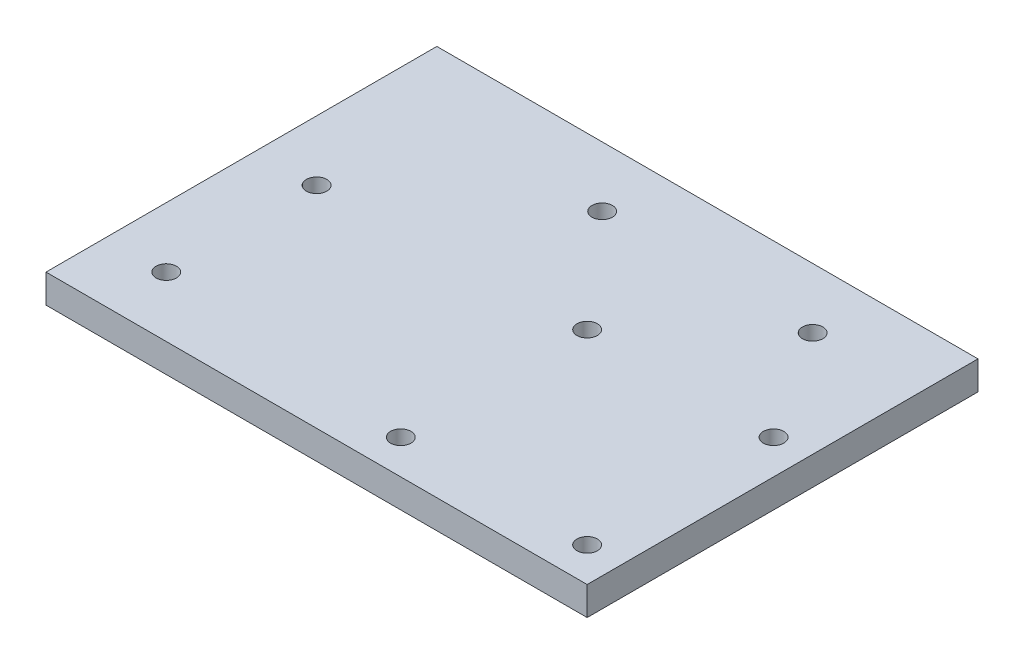
ISO-10303-21;
HEADER;
FILE_DESCRIPTION(('STEP AP214'),'2;1');
FILE_NAME('part.step','',(''),(''),'','','');
FILE_SCHEMA(('AUTOMOTIVE_DESIGN { 1 0 10303 214 1 1 1 1 }'));
ENDSEC;
DATA;
#1=APPLICATION_CONTEXT('core data for automotive mechanical design processes');
#2=APPLICATION_PROTOCOL_DEFINITION('international standard','automotive_design',2000,#1);
#3=PRODUCT_CONTEXT('',#1,'mechanical');
#4=PRODUCT('Part','Part','',(#3));
#5=PRODUCT_RELATED_PRODUCT_CATEGORY('part','',(#4));
#6=PRODUCT_DEFINITION_FORMATION('','',#4);
#7=PRODUCT_DEFINITION_CONTEXT('part definition',#1,'design');
#8=PRODUCT_DEFINITION('design','',#6,#7);
#9=PRODUCT_DEFINITION_SHAPE('','',#8);
#10=(LENGTH_UNIT() NAMED_UNIT(*) SI_UNIT(.MILLI.,.METRE.));
#11=(NAMED_UNIT(*) PLANE_ANGLE_UNIT() SI_UNIT($,.RADIAN.));
#12=(NAMED_UNIT(*) SI_UNIT($,.STERADIAN.) SOLID_ANGLE_UNIT());
#13=UNCERTAINTY_MEASURE_WITH_UNIT(LENGTH_MEASURE(1.E-05),#10,'distance_accuracy_value','');
#14=(GEOMETRIC_REPRESENTATION_CONTEXT(3) GLOBAL_UNCERTAINTY_ASSIGNED_CONTEXT((#13)) GLOBAL_UNIT_ASSIGNED_CONTEXT((#10,
#11,#12)) REPRESENTATION_CONTEXT('',''));
#15=CARTESIAN_POINT('',(0.,0.,0.));
#16=DIRECTION('',(0.,0.,1.));
#17=DIRECTION('',(1.,0.,0.));
#18=AXIS2_PLACEMENT_3D('',#15,#16,#17);
#19=CARTESIAN_POINT('',(90.,4.7625,0.));
#20=DIRECTION('',(-1.,0.,0.));
#21=DIRECTION('',(0.,0.,1.));
#22=AXIS2_PLACEMENT_3D('',#19,#20,#21);
#23=PLANE('',#22);
#24=DIRECTION('',(0.,0.,-1.));
#25=VECTOR('',#24,1.);
#26=CARTESIAN_POINT('',(90.,0.,0.));
#27=LINE('',#26,#25);
#28=CARTESIAN_POINT('',(90.,0.,0.));
#29=VERTEX_POINT('',#28);
#30=CARTESIAN_POINT('',(90.,0.,-65.));
#31=VERTEX_POINT('',#30);
#32=EDGE_CURVE('E96',#29,#31,#27,.T.);
#33=ORIENTED_EDGE('',*,*,#32,.T.);
#34=DIRECTION('',(0.,-1.,0.));
#35=VECTOR('',#34,1.);
#36=CARTESIAN_POINT('',(90.,4.7625,-65.));
#37=LINE('',#36,#35);
#38=CARTESIAN_POINT('',(90.,4.7625,-65.));
#39=VERTEX_POINT('',#38);
#40=EDGE_CURVE('E11',#39,#31,#37,.T.);
#41=ORIENTED_EDGE('',*,*,#40,.F.);
#42=DIRECTION('',(0.,0.,-1.));
#43=VECTOR('',#42,1.);
#44=CARTESIAN_POINT('',(90.,4.7625,0.));
#45=LINE('',#44,#43);
#46=CARTESIAN_POINT('',(90.,4.7625,0.));
#47=VERTEX_POINT('',#46);
#48=EDGE_CURVE('E84',#47,#39,#45,.T.);
#49=ORIENTED_EDGE('',*,*,#48,.F.);
#50=DIRECTION('',(0.,-1.,0.));
#51=VECTOR('',#50,1.);
#52=CARTESIAN_POINT('',(90.,4.7625,0.));
#53=LINE('',#52,#51);
#54=EDGE_CURVE('E92',#47,#29,#53,.T.);
#55=ORIENTED_EDGE('',*,*,#54,.T.);
#56=EDGE_LOOP('',(#33,#41,#49,#55));
#57=FACE_BOUND('',#56,.T.);
#58=ADVANCED_FACE('F33',(#57),#23,.F.);
#59=CARTESIAN_POINT('',(0.,4.7625,-65.));
#60=DIRECTION('',(0.,0.,1.));
#61=DIRECTION('',(1.,0.,0.));
#62=AXIS2_PLACEMENT_3D('',#59,#60,#61);
#63=PLANE('',#62);
#64=DIRECTION('',(-1.,0.,0.));
#65=VECTOR('',#64,1.);
#66=CARTESIAN_POINT('',(0.,0.,-65.));
#67=LINE('',#66,#65);
#68=CARTESIAN_POINT('',(0.,0.,-65.));
#69=VERTEX_POINT('',#68);
#70=EDGE_CURVE('E88',#31,#69,#67,.T.);
#71=ORIENTED_EDGE('',*,*,#70,.T.);
#72=DIRECTION('',(0.,-1.,0.));
#73=VECTOR('',#72,1.);
#74=CARTESIAN_POINT('',(0.,4.7625,-65.));
#75=LINE('',#74,#73);
#76=CARTESIAN_POINT('',(0.,4.7625,-65.));
#77=VERTEX_POINT('',#76);
#78=EDGE_CURVE('E41',#77,#69,#75,.T.);
#79=ORIENTED_EDGE('',*,*,#78,.F.);
#80=DIRECTION('',(-1.,0.,0.));
#81=VECTOR('',#80,1.);
#82=CARTESIAN_POINT('',(0.,4.7625,-65.));
#83=LINE('',#82,#81);
#84=EDGE_CURVE('E79',#39,#77,#83,.T.);
#85=ORIENTED_EDGE('',*,*,#84,.F.);
#86=ORIENTED_EDGE('',*,*,#40,.T.);
#87=EDGE_LOOP('',(#71,#79,#85,#86));
#88=FACE_BOUND('',#87,.T.);
#89=ADVANCED_FACE('F87',(#88),#63,.F.);
#90=CARTESIAN_POINT('',(0.,4.7625,0.));
#91=DIRECTION('',(1.,0.,0.));
#92=DIRECTION('',(0.,0.,-1.));
#93=AXIS2_PLACEMENT_3D('',#90,#91,#92);
#94=PLANE('',#93);
#95=DIRECTION('',(0.,0.,1.));
#96=VECTOR('',#95,1.);
#97=CARTESIAN_POINT('',(0.,0.,0.));
#98=LINE('',#97,#96);
#99=CARTESIAN_POINT('',(0.,0.,0.));
#100=VERTEX_POINT('',#99);
#101=EDGE_CURVE('E66',#69,#100,#98,.T.);
#102=ORIENTED_EDGE('',*,*,#101,.T.);
#103=DIRECTION('',(0.,-1.,0.));
#104=VECTOR('',#103,1.);
#105=CARTESIAN_POINT('',(0.,4.7625,0.));
#106=LINE('',#105,#104);
#107=CARTESIAN_POINT('',(0.,4.7625,0.));
#108=VERTEX_POINT('',#107);
#109=EDGE_CURVE('E89',#108,#100,#106,.T.);
#110=ORIENTED_EDGE('',*,*,#109,.F.);
#111=DIRECTION('',(0.,0.,1.));
#112=VECTOR('',#111,1.);
#113=CARTESIAN_POINT('',(0.,4.7625,0.));
#114=LINE('',#113,#112);
#115=EDGE_CURVE('E82',#77,#108,#114,.T.);
#116=ORIENTED_EDGE('',*,*,#115,.F.);
#117=ORIENTED_EDGE('',*,*,#78,.T.);
#118=EDGE_LOOP('',(#102,#110,#116,#117));
#119=FACE_BOUND('',#118,.T.);
#120=ADVANCED_FACE('F90',(#119),#94,.F.);
#121=CARTESIAN_POINT('',(0.,4.7625,0.));
#122=DIRECTION('',(0.,0.,-1.));
#123=DIRECTION('',(-1.,0.,0.));
#124=AXIS2_PLACEMENT_3D('',#121,#122,#123);
#125=PLANE('',#124);
#126=DIRECTION('',(1.,0.,0.));
#127=VECTOR('',#126,1.);
#128=CARTESIAN_POINT('',(0.,0.,0.));
#129=LINE('',#128,#127);
#130=EDGE_CURVE('E72',#100,#29,#129,.T.);
#131=ORIENTED_EDGE('',*,*,#130,.T.);
#132=ORIENTED_EDGE('',*,*,#54,.F.);
#133=DIRECTION('',(1.,0.,0.));
#134=VECTOR('',#133,1.);
#135=CARTESIAN_POINT('',(0.,4.7625,0.));
#136=LINE('',#135,#134);
#137=EDGE_CURVE('E49',#108,#47,#136,.T.);
#138=ORIENTED_EDGE('',*,*,#137,.F.);
#139=ORIENTED_EDGE('',*,*,#109,.T.);
#140=EDGE_LOOP('',(#131,#132,#138,#139));
#141=FACE_BOUND('',#140,.T.);
#142=ADVANCED_FACE('F104',(#141),#125,.F.);
#143=CARTESIAN_POINT('',(0.,4.7625,0.));
#144=DIRECTION('',(0.,-1.,0.));
#145=DIRECTION('',(0.,0.,-1.));
#146=AXIS2_PLACEMENT_3D('',#143,#144,#145);
#147=PLANE('',#146);
#148=CARTESIAN_POINT('',(37.5,4.7625,-55.));
#149=DIRECTION('',(0.,-1.,0.));
#150=DIRECTION('',(0.,0.,-1.));
#151=AXIS2_PLACEMENT_3D('',#148,#149,#150);
#152=CIRCLE('',#151,1.7);
#153=CARTESIAN_POINT('',(37.5,4.7625,-56.7));
#154=VERTEX_POINT('',#153);
#155=EDGE_CURVE('E151',#154,#154,#152,.T.);
#156=ORIENTED_EDGE('',*,*,#155,.T.);
#157=EDGE_LOOP('',(#156));
#158=FACE_BOUND('',#157,.T.);
#159=CARTESIAN_POINT('',(72.5,4.7625,-55.));
#160=DIRECTION('',(0.,-1.,0.));
#161=DIRECTION('',(0.,0.,-1.));
#162=AXIS2_PLACEMENT_3D('',#159,#160,#161);
#163=CIRCLE('',#162,1.69999999999999);
#164=CARTESIAN_POINT('',(72.5,4.7625,-56.7));
#165=VERTEX_POINT('',#164);
#166=EDGE_CURVE('E145',#165,#165,#163,.T.);
#167=ORIENTED_EDGE('',*,*,#166,.T.);
#168=EDGE_LOOP('',(#167));
#169=FACE_BOUND('',#168,.T.);
#170=CARTESIAN_POINT('',(10.,4.7625,-35.));
#171=DIRECTION('',(0.,-1.,0.));
#172=DIRECTION('',(0.,0.,-1.));
#173=AXIS2_PLACEMENT_3D('',#170,#171,#172);
#174=CIRCLE('',#173,1.7);
#175=CARTESIAN_POINT('',(10.,4.7625,-36.7));
#176=VERTEX_POINT('',#175);
#177=EDGE_CURVE('E139',#176,#176,#174,.T.);
#178=ORIENTED_EDGE('',*,*,#177,.T.);
#179=EDGE_LOOP('',(#178));
#180=FACE_BOUND('',#179,.T.);
#181=CARTESIAN_POINT('',(10.,4.7625,-10.));
#182=DIRECTION('',(0.,-1.,0.));
#183=DIRECTION('',(0.,0.,-1.));
#184=AXIS2_PLACEMENT_3D('',#181,#182,#183);
#185=CIRCLE('',#184,1.7);
#186=CARTESIAN_POINT('',(10.,4.7625,-11.7));
#187=VERTEX_POINT('',#186);
#188=EDGE_CURVE('E133',#187,#187,#185,.T.);
#189=ORIENTED_EDGE('',*,*,#188,.T.);
#190=EDGE_LOOP('',(#189));
#191=FACE_BOUND('',#190,.T.);
#192=CARTESIAN_POINT('',(84.2909999999999,4.7625,-5.70900000000008));
#193=DIRECTION('',(0.,1.,0.));
#194=DIRECTION('',(0.,0.,1.));
#195=AXIS2_PLACEMENT_3D('',#192,#193,#194);
#196=CIRCLE('',#195,1.69999999999999);
#197=CARTESIAN_POINT('',(84.2909999999999,4.7625,-4.00900000000008));
#198=VERTEX_POINT('',#197);
#199=EDGE_CURVE('E130',#198,#198,#196,.T.);
#200=ORIENTED_EDGE('',*,*,#199,.F.);
#201=EDGE_LOOP('',(#200));
#202=FACE_BOUND('',#201,.T.);
#203=CARTESIAN_POINT('',(84.2909999999999,4.7625,-36.7090000000001));
#204=DIRECTION('',(0.,1.,0.));
#205=DIRECTION('',(0.,0.,1.));
#206=AXIS2_PLACEMENT_3D('',#203,#204,#205);
#207=CIRCLE('',#206,1.69999999999999);
#208=CARTESIAN_POINT('',(84.2909999999999,4.7625,-35.0090000000001));
#209=VERTEX_POINT('',#208);
#210=EDGE_CURVE('E124',#209,#209,#207,.T.);
#211=ORIENTED_EDGE('',*,*,#210,.F.);
#212=EDGE_LOOP('',(#211));
#213=FACE_BOUND('',#212,.T.);
#214=CARTESIAN_POINT('',(53.2909999999999,4.7625,-36.7090000000001));
#215=DIRECTION('',(0.,1.,0.));
#216=DIRECTION('',(0.,0.,1.));
#217=AXIS2_PLACEMENT_3D('',#214,#215,#216);
#218=CIRCLE('',#217,1.7);
#219=CARTESIAN_POINT('',(53.2909999999999,4.7625,-35.0090000000001));
#220=VERTEX_POINT('',#219);
#221=EDGE_CURVE('E118',#220,#220,#218,.T.);
#222=ORIENTED_EDGE('',*,*,#221,.F.);
#223=EDGE_LOOP('',(#222));
#224=FACE_BOUND('',#223,.T.);
#225=CARTESIAN_POINT('',(53.2909999999999,4.7625,-5.70900000000008));
#226=DIRECTION('',(0.,1.,0.));
#227=DIRECTION('',(0.,0.,1.));
#228=AXIS2_PLACEMENT_3D('',#225,#226,#227);
#229=CIRCLE('',#228,1.7);
#230=CARTESIAN_POINT('',(53.2909999999999,4.7625,-4.00900000000007));
#231=VERTEX_POINT('',#230);
#232=EDGE_CURVE('E112',#231,#231,#229,.T.);
#233=ORIENTED_EDGE('',*,*,#232,.F.);
#234=EDGE_LOOP('',(#233));
#235=FACE_BOUND('',#234,.T.);
#236=ORIENTED_EDGE('',*,*,#48,.T.);
#237=ORIENTED_EDGE('',*,*,#84,.T.);
#238=ORIENTED_EDGE('',*,*,#115,.T.);
#239=ORIENTED_EDGE('',*,*,#137,.T.);
#240=EDGE_LOOP('',(#236,#237,#238,#239));
#241=FACE_BOUND('',#240,.T.);
#242=ADVANCED_FACE('F80',(#158,#169,#180,#191,#202,#213,#224,#235,#241),#147,.F.);
#243=CARTESIAN_POINT('',(0.,0.,0.));
#244=DIRECTION('',(0.,-1.,0.));
#245=DIRECTION('',(0.,0.,-1.));
#246=AXIS2_PLACEMENT_3D('',#243,#244,#245);
#247=PLANE('',#246);
#248=CARTESIAN_POINT('',(37.5,0.,-55.));
#249=DIRECTION('',(0.,-1.,0.));
#250=DIRECTION('',(0.,0.,-1.));
#251=AXIS2_PLACEMENT_3D('',#248,#249,#250);
#252=CIRCLE('',#251,1.69999999999999);
#253=CARTESIAN_POINT('',(37.5,0.,-56.7));
#254=VERTEX_POINT('',#253);
#255=EDGE_CURVE('E154',#254,#254,#252,.T.);
#256=ORIENTED_EDGE('',*,*,#255,.F.);
#257=EDGE_LOOP('',(#256));
#258=FACE_BOUND('',#257,.T.);
#259=CARTESIAN_POINT('',(72.5,0.,-55.));
#260=DIRECTION('',(0.,-1.,0.));
#261=DIRECTION('',(0.,0.,-1.));
#262=AXIS2_PLACEMENT_3D('',#259,#260,#261);
#263=CIRCLE('',#262,1.69999999999999);
#264=CARTESIAN_POINT('',(72.5,0.,-56.7));
#265=VERTEX_POINT('',#264);
#266=EDGE_CURVE('E148',#265,#265,#263,.T.);
#267=ORIENTED_EDGE('',*,*,#266,.F.);
#268=EDGE_LOOP('',(#267));
#269=FACE_BOUND('',#268,.T.);
#270=CARTESIAN_POINT('',(10.,0.,-35.));
#271=DIRECTION('',(0.,-1.,0.));
#272=DIRECTION('',(0.,0.,-1.));
#273=AXIS2_PLACEMENT_3D('',#270,#271,#272);
#274=CIRCLE('',#273,1.69999999999999);
#275=CARTESIAN_POINT('',(10.,0.,-36.7));
#276=VERTEX_POINT('',#275);
#277=EDGE_CURVE('E142',#276,#276,#274,.T.);
#278=ORIENTED_EDGE('',*,*,#277,.F.);
#279=EDGE_LOOP('',(#278));
#280=FACE_BOUND('',#279,.T.);
#281=CARTESIAN_POINT('',(10.,0.,-10.));
#282=DIRECTION('',(0.,-1.,0.));
#283=DIRECTION('',(0.,0.,-1.));
#284=AXIS2_PLACEMENT_3D('',#281,#282,#283);
#285=CIRCLE('',#284,1.69999999999999);
#286=CARTESIAN_POINT('',(10.,0.,-11.7));
#287=VERTEX_POINT('',#286);
#288=EDGE_CURVE('E136',#287,#287,#285,.T.);
#289=ORIENTED_EDGE('',*,*,#288,.F.);
#290=EDGE_LOOP('',(#289));
#291=FACE_BOUND('',#290,.T.);
#292=CARTESIAN_POINT('',(84.2909999999999,0.,-5.70900000000008));
#293=DIRECTION('',(0.,1.,0.));
#294=DIRECTION('',(0.,0.,1.));
#295=AXIS2_PLACEMENT_3D('',#292,#293,#294);
#296=CIRCLE('',#295,1.69999999999999);
#297=CARTESIAN_POINT('',(84.2909999999999,0.,-4.00900000000008));
#298=VERTEX_POINT('',#297);
#299=EDGE_CURVE('E127',#298,#298,#296,.T.);
#300=ORIENTED_EDGE('',*,*,#299,.T.);
#301=EDGE_LOOP('',(#300));
#302=FACE_BOUND('',#301,.T.);
#303=CARTESIAN_POINT('',(84.2909999999999,0.,-36.7090000000001));
#304=DIRECTION('',(0.,1.,0.));
#305=DIRECTION('',(0.,0.,1.));
#306=AXIS2_PLACEMENT_3D('',#303,#304,#305);
#307=CIRCLE('',#306,1.69999999999999);
#308=CARTESIAN_POINT('',(84.2909999999999,0.,-35.0090000000001));
#309=VERTEX_POINT('',#308);
#310=EDGE_CURVE('E121',#309,#309,#307,.T.);
#311=ORIENTED_EDGE('',*,*,#310,.T.);
#312=EDGE_LOOP('',(#311));
#313=FACE_BOUND('',#312,.T.);
#314=CARTESIAN_POINT('',(53.2909999999999,0.,-36.7090000000001));
#315=DIRECTION('',(0.,1.,0.));
#316=DIRECTION('',(0.,0.,1.));
#317=AXIS2_PLACEMENT_3D('',#314,#315,#316);
#318=CIRCLE('',#317,1.7);
#319=CARTESIAN_POINT('',(53.2909999999999,0.,-35.0090000000001));
#320=VERTEX_POINT('',#319);
#321=EDGE_CURVE('E115',#320,#320,#318,.T.);
#322=ORIENTED_EDGE('',*,*,#321,.T.);
#323=EDGE_LOOP('',(#322));
#324=FACE_BOUND('',#323,.T.);
#325=CARTESIAN_POINT('',(53.2909999999999,0.,-5.70900000000008));
#326=DIRECTION('',(0.,1.,0.));
#327=DIRECTION('',(0.,0.,1.));
#328=AXIS2_PLACEMENT_3D('',#325,#326,#327);
#329=CIRCLE('',#328,1.7);
#330=CARTESIAN_POINT('',(53.2909999999999,0.,-4.00900000000007));
#331=VERTEX_POINT('',#330);
#332=EDGE_CURVE('E99',#331,#331,#329,.T.);
#333=ORIENTED_EDGE('',*,*,#332,.T.);
#334=EDGE_LOOP('',(#333));
#335=FACE_BOUND('',#334,.T.);
#336=ORIENTED_EDGE('',*,*,#32,.F.);
#337=ORIENTED_EDGE('',*,*,#130,.F.);
#338=ORIENTED_EDGE('',*,*,#101,.F.);
#339=ORIENTED_EDGE('',*,*,#70,.F.);
#340=EDGE_LOOP('',(#336,#337,#338,#339));
#341=FACE_BOUND('',#340,.T.);
#342=ADVANCED_FACE('F107',(#258,#269,#280,#291,#302,#313,#324,#335,#341),#247,.T.);
#343=CARTESIAN_POINT('',(53.2909999999999,4.7625,-5.70900000000008));
#344=DIRECTION('',(0.,1.,0.));
#345=DIRECTION('',(0.,0.,1.));
#346=AXIS2_PLACEMENT_3D('',#343,#344,#345);
#347=CYLINDRICAL_SURFACE('',#346,1.7);
#348=ORIENTED_EDGE('',*,*,#332,.F.);
#349=EDGE_LOOP('',(#348));
#350=FACE_BOUND('',#349,.T.);
#351=ORIENTED_EDGE('',*,*,#232,.T.);
#352=EDGE_LOOP('',(#351));
#353=FACE_BOUND('',#352,.T.);
#354=ADVANCED_FACE('F162',(#350,#353),#347,.F.);
#355=CARTESIAN_POINT('',(53.2909999999999,4.7625,-36.7090000000001));
#356=DIRECTION('',(0.,1.,0.));
#357=DIRECTION('',(0.,0.,1.));
#358=AXIS2_PLACEMENT_3D('',#355,#356,#357);
#359=CYLINDRICAL_SURFACE('',#358,1.7);
#360=ORIENTED_EDGE('',*,*,#321,.F.);
#361=EDGE_LOOP('',(#360));
#362=FACE_BOUND('',#361,.T.);
#363=ORIENTED_EDGE('',*,*,#221,.T.);
#364=EDGE_LOOP('',(#363));
#365=FACE_BOUND('',#364,.T.);
#366=ADVANCED_FACE('F180',(#362,#365),#359,.F.);
#367=CARTESIAN_POINT('',(84.2909999999999,4.7625,-36.7090000000001));
#368=DIRECTION('',(0.,1.,0.));
#369=DIRECTION('',(0.,0.,1.));
#370=AXIS2_PLACEMENT_3D('',#367,#368,#369);
#371=CYLINDRICAL_SURFACE('',#370,1.69999999999999);
#372=ORIENTED_EDGE('',*,*,#310,.F.);
#373=EDGE_LOOP('',(#372));
#374=FACE_BOUND('',#373,.T.);
#375=ORIENTED_EDGE('',*,*,#210,.T.);
#376=EDGE_LOOP('',(#375));
#377=FACE_BOUND('',#376,.T.);
#378=ADVANCED_FACE('F223',(#374,#377),#371,.F.);
#379=CARTESIAN_POINT('',(84.2909999999999,4.7625,-5.70900000000008));
#380=DIRECTION('',(0.,1.,0.));
#381=DIRECTION('',(0.,0.,1.));
#382=AXIS2_PLACEMENT_3D('',#379,#380,#381);
#383=CYLINDRICAL_SURFACE('',#382,1.69999999999999);
#384=ORIENTED_EDGE('',*,*,#299,.F.);
#385=EDGE_LOOP('',(#384));
#386=FACE_BOUND('',#385,.T.);
#387=ORIENTED_EDGE('',*,*,#199,.T.);
#388=EDGE_LOOP('',(#387));
#389=FACE_BOUND('',#388,.T.);
#390=ADVANCED_FACE('F233',(#386,#389),#383,.F.);
#391=CARTESIAN_POINT('',(10.,0.,-10.));
#392=DIRECTION('',(0.,-1.,0.));
#393=DIRECTION('',(0.,0.,-1.));
#394=AXIS2_PLACEMENT_3D('',#391,#392,#393);
#395=CYLINDRICAL_SURFACE('',#394,1.69999999999999);
#396=ORIENTED_EDGE('',*,*,#188,.F.);
#397=EDGE_LOOP('',(#396));
#398=FACE_BOUND('',#397,.T.);
#399=ORIENTED_EDGE('',*,*,#288,.T.);
#400=EDGE_LOOP('',(#399));
#401=FACE_BOUND('',#400,.T.);
#402=ADVANCED_FACE('F242',(#398,#401),#395,.F.);
#403=CARTESIAN_POINT('',(10.,0.,-35.));
#404=DIRECTION('',(0.,-1.,0.));
#405=DIRECTION('',(0.,0.,-1.));
#406=AXIS2_PLACEMENT_3D('',#403,#404,#405);
#407=CYLINDRICAL_SURFACE('',#406,1.69999999999999);
#408=ORIENTED_EDGE('',*,*,#177,.F.);
#409=EDGE_LOOP('',(#408));
#410=FACE_BOUND('',#409,.T.);
#411=ORIENTED_EDGE('',*,*,#277,.T.);
#412=EDGE_LOOP('',(#411));
#413=FACE_BOUND('',#412,.T.);
#414=ADVANCED_FACE('F261',(#410,#413),#407,.F.);
#415=CARTESIAN_POINT('',(72.5,0.,-55.));
#416=DIRECTION('',(0.,-1.,0.));
#417=DIRECTION('',(0.,0.,-1.));
#418=AXIS2_PLACEMENT_3D('',#415,#416,#417);
#419=CYLINDRICAL_SURFACE('',#418,1.69999999999999);
#420=ORIENTED_EDGE('',*,*,#166,.F.);
#421=EDGE_LOOP('',(#420));
#422=FACE_BOUND('',#421,.T.);
#423=ORIENTED_EDGE('',*,*,#266,.T.);
#424=EDGE_LOOP('',(#423));
#425=FACE_BOUND('',#424,.T.);
#426=ADVANCED_FACE('F271',(#422,#425),#419,.F.);
#427=CARTESIAN_POINT('',(37.5,0.,-55.));
#428=DIRECTION('',(0.,-1.,0.));
#429=DIRECTION('',(0.,0.,-1.));
#430=AXIS2_PLACEMENT_3D('',#427,#428,#429);
#431=CYLINDRICAL_SURFACE('',#430,1.69999999999999);
#432=ORIENTED_EDGE('',*,*,#155,.F.);
#433=EDGE_LOOP('',(#432));
#434=FACE_BOUND('',#433,.T.);
#435=ORIENTED_EDGE('',*,*,#255,.T.);
#436=EDGE_LOOP('',(#435));
#437=FACE_BOUND('',#436,.T.);
#438=ADVANCED_FACE('F158',(#434,#437),#431,.F.);
#439=CLOSED_SHELL('',(#58,#89,#120,#142,#242,#342,#354,#366,#378,#390,#402,#414,#426,#438));
#440=MANIFOLD_SOLID_BREP('B2',#439);
#441=ADVANCED_BREP_SHAPE_REPRESENTATION('',(#18,#440),#14);
#442=SHAPE_DEFINITION_REPRESENTATION(#9,#441);
ENDSEC;
END-ISO-10303-21;
